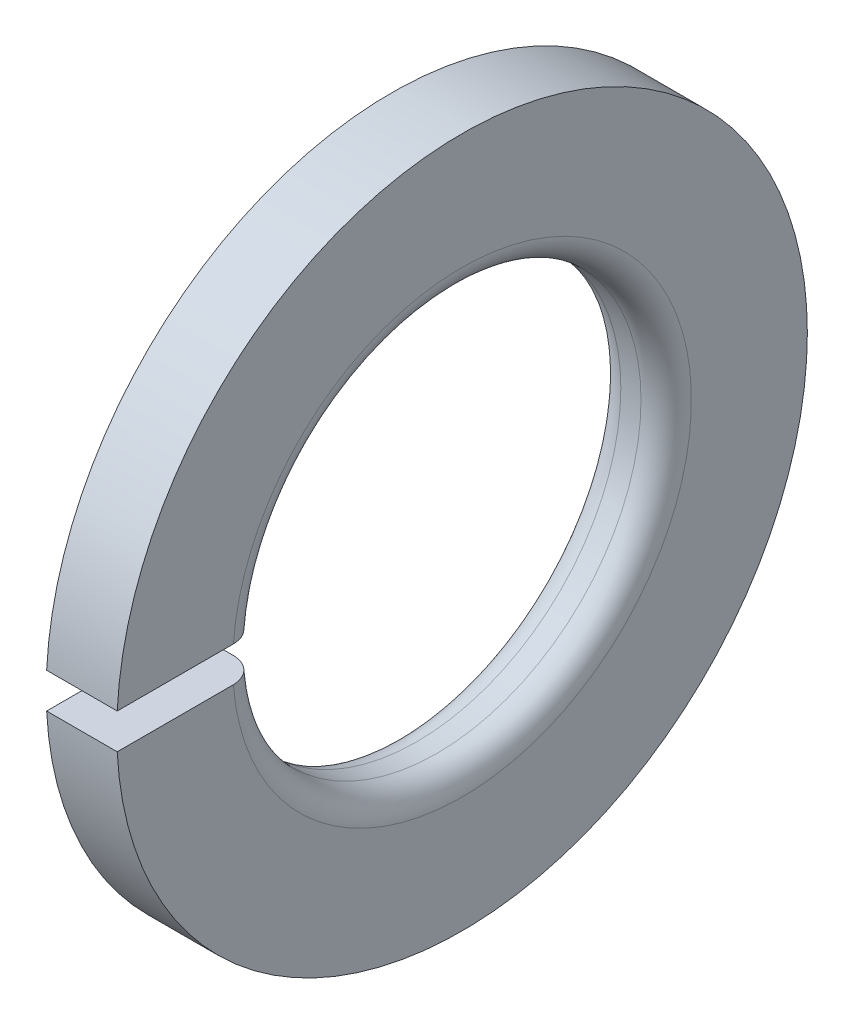
ISO-10303-21;
HEADER;
FILE_DESCRIPTION(('STEP AP214'),'2;1');
FILE_NAME('part.step','',(''),(''),'','','');
FILE_SCHEMA(('AUTOMOTIVE_DESIGN { 1 0 10303 214 1 1 1 1 }'));
ENDSEC;
DATA;
#1=APPLICATION_CONTEXT('core data for automotive mechanical design processes');
#2=APPLICATION_PROTOCOL_DEFINITION('international standard','automotive_design',2000,#1);
#3=PRODUCT_CONTEXT('',#1,'mechanical');
#4=PRODUCT('Part','Part','',(#3));
#5=PRODUCT_RELATED_PRODUCT_CATEGORY('part','',(#4));
#6=PRODUCT_DEFINITION_FORMATION('','',#4);
#7=PRODUCT_DEFINITION_CONTEXT('part definition',#1,'design');
#8=PRODUCT_DEFINITION('design','',#6,#7);
#9=PRODUCT_DEFINITION_SHAPE('','',#8);
#10=(LENGTH_UNIT() NAMED_UNIT(*) SI_UNIT(.MILLI.,.METRE.));
#11=(NAMED_UNIT(*) PLANE_ANGLE_UNIT() SI_UNIT($,.RADIAN.));
#12=(NAMED_UNIT(*) SI_UNIT($,.STERADIAN.) SOLID_ANGLE_UNIT());
#13=UNCERTAINTY_MEASURE_WITH_UNIT(LENGTH_MEASURE(1.E-05),#10,'distance_accuracy_value','');
#14=(GEOMETRIC_REPRESENTATION_CONTEXT(3) GLOBAL_UNCERTAINTY_ASSIGNED_CONTEXT((#13)) GLOBAL_UNIT_ASSIGNED_CONTEXT((#10,
#11,#12)) REPRESENTATION_CONTEXT('',''));
#15=CARTESIAN_POINT('',(0.,0.,0.));
#16=DIRECTION('',(0.,0.,1.));
#17=DIRECTION('',(1.,0.,0.));
#18=AXIS2_PLACEMENT_3D('',#15,#16,#17);
#19=CARTESIAN_POINT('',(-34.9249999999999,0.,0.));
#20=DIRECTION('',(-1.,0.,0.));
#21=DIRECTION('',(0.,0.,1.));
#22=AXIS2_PLACEMENT_3D('',#19,#20,#21);
#23=CYLINDRICAL_SURFACE('',#22,13.7);
#24=DIRECTION('',(-1.,0.,0.));
#25=VECTOR('',#24,1.);
#26=CARTESIAN_POINT('',(-34.9249999999999,0.7,13.6821051011897));
#27=LINE('',#26,#25);
#28=CARTESIAN_POINT('',(0.,0.7,13.6821051011897));
#29=VERTEX_POINT('',#28);
#30=CARTESIAN_POINT('',(-2.8,0.699999999999999,13.6821051011897));
#31=VERTEX_POINT('',#30);
#32=EDGE_CURVE('E55',#29,#31,#27,.T.);
#33=ORIENTED_EDGE('',*,*,#32,.F.);
#34=CARTESIAN_POINT('',(0.,0.,0.));
#35=DIRECTION('',(-1.,0.,0.));
#36=DIRECTION('',(0.,0.,1.));
#37=AXIS2_PLACEMENT_3D('',#34,#35,#36);
#38=CIRCLE('',#37,13.7);
#39=CARTESIAN_POINT('',(0.,-0.7,13.6821051011897));
#40=VERTEX_POINT('',#39);
#41=EDGE_CURVE('E113',#29,#40,#38,.T.);
#42=ORIENTED_EDGE('',*,*,#41,.T.);
#43=DIRECTION('',(-1.,0.,0.));
#44=VECTOR('',#43,1.);
#45=CARTESIAN_POINT('',(-34.9249999999999,-0.7,13.6821051011897));
#46=LINE('',#45,#44);
#47=CARTESIAN_POINT('',(-2.8,-0.7,13.6821051011897));
#48=VERTEX_POINT('',#47);
#49=EDGE_CURVE('E91',#48,#40,#46,.F.);
#50=ORIENTED_EDGE('',*,*,#49,.F.);
#51=CARTESIAN_POINT('',(-2.8,0.,0.));
#52=DIRECTION('',(-1.,0.,0.));
#53=DIRECTION('',(0.,0.,1.));
#54=AXIS2_PLACEMENT_3D('',#51,#52,#53);
#55=CIRCLE('',#54,13.7);
#56=EDGE_CURVE('E123',#31,#48,#55,.T.);
#57=ORIENTED_EDGE('',*,*,#56,.F.);
#58=EDGE_LOOP('',(#33,#42,#50,#57));
#59=FACE_BOUND('',#58,.T.);
#60=ADVANCED_FACE('F39',(#59),#23,.T.);
#61=CARTESIAN_POINT('',(0.,9.1,0.));
#62=DIRECTION('',(-1.,0.,0.));
#63=DIRECTION('',(0.,0.,1.));
#64=AXIS2_PLACEMENT_3D('',#61,#62,#63);
#65=PLANE('',#64);
#66=DIRECTION('',(0.,0.,-1.));
#67=VECTOR('',#66,1.);
#68=CARTESIAN_POINT('',(0.,0.7,13.974));
#69=LINE('',#68,#67);
#70=CARTESIAN_POINT('',(0.,0.7,9.073036977771));
#71=VERTEX_POINT('',#70);
#72=EDGE_CURVE('E100',#29,#71,#69,.T.);
#73=ORIENTED_EDGE('',*,*,#72,.T.);
#74=CARTESIAN_POINT('',(0.,0.,0.));
#75=DIRECTION('',(-1.,0.,0.));
#76=DIRECTION('',(0.,0.,1.));
#77=AXIS2_PLACEMENT_3D('',#74,#75,#76);
#78=CIRCLE('',#77,9.1);
#79=CARTESIAN_POINT('',(0.,-0.7,9.073036977771));
#80=VERTEX_POINT('',#79);
#81=EDGE_CURVE('E106',#71,#80,#78,.T.);
#82=ORIENTED_EDGE('',*,*,#81,.T.);
#83=DIRECTION('',(0.,0.,1.));
#84=VECTOR('',#83,1.);
#85=CARTESIAN_POINT('',(0.,-0.7,0.));
#86=LINE('',#85,#84);
#87=EDGE_CURVE('E89',#80,#40,#86,.T.);
#88=ORIENTED_EDGE('',*,*,#87,.T.);
#89=ORIENTED_EDGE('',*,*,#41,.F.);
#90=EDGE_LOOP('',(#73,#82,#88,#89));
#91=FACE_BOUND('',#90,.T.);
#92=ADVANCED_FACE('F115',(#91),#65,.F.);
#93=CARTESIAN_POINT('',(-1.,0.,0.));
#94=DIRECTION('',(-1.,0.,0.));
#95=DIRECTION('',(0.,0.,1.));
#96=AXIS2_PLACEMENT_3D('',#93,#94,#95);
#97=TOROIDAL_SURFACE('',#96,9.1,1.);
#98=ORIENTED_EDGE('',*,*,#81,.F.);
#99=CARTESIAN_POINT('',(-0.662612223968042,0.7,8.12854923771154));
#100=CARTESIAN_POINT('',(-0.715290187184425,0.7,8.10960209112794));
#101=CARTESIAN_POINT('',(-0.769604490981388,0.7,8.09508547757077));
#102=CARTESIAN_POINT('',(-0.879943985011158,0.7,8.07536673973953));
#103=CARTESIAN_POINT('',(-0.935971109099094,0.7,8.07017557147823));
#104=CARTESIAN_POINT('',(-1.04808100072817,0.7,8.06928105309722));
#105=CARTESIAN_POINT('',(-1.10416373188471,0.7,8.07357343455055));
#106=CARTESIAN_POINT('',(-1.21479686972179,0.7,8.09151311798309));
#107=CARTESIAN_POINT('',(-1.26934764208393,0.7,8.10515816736053));
#108=CARTESIAN_POINT('',(-1.37539140132287,0.7,8.1414051319421));
#109=CARTESIAN_POINT('',(-1.42688417551952,0.7,8.164007669292));
#110=CARTESIAN_POINT('',(-1.52535824885668,0.7,8.21751835592763));
#111=CARTESIAN_POINT('',(-1.57233933290822,0.7,8.24842690092499));
#112=CARTESIAN_POINT('',(-1.66057357248227,0.7,8.31774363364718));
#113=CARTESIAN_POINT('',(-1.70181327543891,0.7,8.35616894392833));
#114=CARTESIAN_POINT('',(-1.77728353312244,0.7,8.43937649820842));
#115=CARTESIAN_POINT('',(-1.81151397169577,0.7,8.48415884753178));
#116=CARTESIAN_POINT('',(-1.872118219197,0.7,8.57897480683965));
#117=CARTESIAN_POINT('',(-1.89846459379726,0.7,8.62902595272247));
#118=CARTESIAN_POINT('',(-1.94240697284814,0.7,8.73283232009971));
#119=CARTESIAN_POINT('',(-1.9600028492787,0.7,8.78658759577257));
#120=CARTESIAN_POINT('',(-1.98598908804086,0.7,8.89643434965801));
#121=CARTESIAN_POINT('',(-1.99435421122937,0.7,8.95253180000836));
#122=CARTESIAN_POINT('',(-2.001556851649,0.7,9.06533538025177));
#123=CARTESIAN_POINT('',(-2.00039428955911,0.7,9.12204151520838));
#124=CARTESIAN_POINT('',(-1.98856554771714,0.7,9.23450309817939));
#125=CARTESIAN_POINT('',(-1.97789128424346,0.7,9.29025769642485));
#126=CARTESIAN_POINT('',(-1.94732360140483,0.7,9.39917999489627));
#127=CARTESIAN_POINT('',(-1.92743021812544,0.7,9.45234770524695));
#128=CARTESIAN_POINT('',(-1.87900768811972,0.7,9.5545218540676));
#129=CARTESIAN_POINT('',(-1.85048808871843,0.7,9.6035328167463));
#130=CARTESIAN_POINT('',(-1.78560729700964,0.7,9.6960563071021));
#131=CARTESIAN_POINT('',(-1.74924619209137,0.7,9.73956889604696));
#132=CARTESIAN_POINT('',(-1.66980388227848,0.7,9.8197515832266));
#133=CARTESIAN_POINT('',(-1.62673846953807,0.7,9.85643732744043));
#134=CARTESIAN_POINT('',(-1.53504671660828,0.7,9.92203619941413));
#135=CARTESIAN_POINT('',(-1.4864204533591,0.7,9.95094943469627));
#136=CARTESIAN_POINT('',(-1.38511893512821,0.7,10.0001070958684));
#137=CARTESIAN_POINT('',(-1.33245416335104,0.7,10.0203731258802));
#138=CARTESIAN_POINT('',(-1.2244661377543,0.7,10.0517577626579));
#139=CARTESIAN_POINT('',(-1.16914291378149,0.7,10.0628764720965));
#140=CARTESIAN_POINT('',(-1.05751558605269,0.7,10.0756341759747));
#141=CARTESIAN_POINT('',(-1.00121343419212,0.7,10.0772902543729));
#142=CARTESIAN_POINT('',(-0.88913124376719,0.7,10.0711209067789));
#143=CARTESIAN_POINT('',(-0.833351202403051,0.7,10.0632955316596));
#144=CARTESIAN_POINT('',(-0.723927237746713,0.7,10.0383952938473));
#145=CARTESIAN_POINT('',(-0.670282183080897,0.7,10.0213254020063));
#146=CARTESIAN_POINT('',(-0.566615631176858,0.7,9.97842937843337));
#147=CARTESIAN_POINT('',(-0.516594143798551,0.7,9.95260322287635));
#148=CARTESIAN_POINT('',(-0.421544725833252,0.7,9.89290726969362));
#149=CARTESIAN_POINT('',(-0.376521257930688,0.7,9.8590303670492));
#150=CARTESIAN_POINT('',(-0.292786344089414,0.7,9.78421280440886));
#151=CARTESIAN_POINT('',(-0.254074950161213,0.7,9.74327208621394));
#152=CARTESIAN_POINT('',(-0.183976523702315,0.7,9.65540102628795));
#153=CARTESIAN_POINT('',(-0.152604635323968,0.7,9.60845860392524));
#154=CARTESIAN_POINT('',(-0.0981636876420108,0.7,9.50998372210034));
#155=CARTESIAN_POINT('',(-0.0750947568726635,0.7,9.45845119159622));
#156=CARTESIAN_POINT('',(-0.037852821167495,0.7,9.35211817316768));
#157=CARTESIAN_POINT('',(-0.0237026781344732,0.7,9.29730967794539));
#158=CARTESIAN_POINT('',(-0.00478318965724145,0.7,9.18609666721856));
#159=CARTESIAN_POINT('',(-1.39876148040783E-05,0.7,9.12969212732944));
#160=CARTESIAN_POINT('',(1.39556668232213E-05,0.7,9.01675985166794));
#161=CARTESIAN_POINT('',(-0.00474764154095429,0.7,8.96023211012359));
#162=CARTESIAN_POINT('',(-0.023686204729508,0.7,8.84877833925974));
#163=CARTESIAN_POINT('',(-0.0378628719536005,0.7,8.79385225917444));
#164=CARTESIAN_POINT('',(-0.0752439744802041,0.7,8.68712722469199));
#165=CARTESIAN_POINT('',(-0.0984536308746889,0.7,8.63533009887745));
#166=CARTESIAN_POINT('',(-0.153257937364711,0.7,8.53636087234999));
#167=CARTESIAN_POINT('',(-0.184854635124728,0.7,8.48918990495293));
#168=CARTESIAN_POINT('',(-0.255503579684132,0.7,8.40088177133867));
#169=CARTESIAN_POINT('',(-0.294549315658855,0.7,8.35973939095738));
#170=CARTESIAN_POINT('',(-0.378985054976843,0.7,8.28465942454279));
#171=CARTESIAN_POINT('',(-0.424367252423489,0.7,8.25071310131935));
#172=CARTESIAN_POINT('',(-0.502233128389707,0.7,8.20215332114461));
#173=CARTESIAN_POINT('',(-0.533197434447881,0.7,8.18505636464488));
#174=CARTESIAN_POINT('',(-0.596761241176335,0.7,8.15423425186091));
#175=CARTESIAN_POINT('',(-0.62936073991182,0.7,8.14050909158721));
#176=CARTESIAN_POINT('',(-0.662612223968042,0.7,8.12854923771154));
#177=B_SPLINE_CURVE_WITH_KNOTS('',3,(#99,#100,#101,#102,#103,#104,#105,#106,#107,#108,#109,#110,
#111,#112,#113,#114,#115,#116,#117,#118,#119,#120,#121,#122,#123,#124,#125,#126,#127,#128,#129,
#130,#131,#132,#133,#134,#135,#136,#137,#138,#139,#140,#141,#142,#143,#144,#145,#146,#147,#148,
#149,#150,#151,#152,#153,#154,#155,#156,#157,#158,#159,#160,#161,#162,#163,#164,#165,#166,#167,
#168,#169,#170,#171,#172,#173,#174,#175,#176),.UNSPECIFIED.,.T.,.F.,(4,2,2,2,2,2,2,2,2,2,2,2,2,
2,2,2,2,2,2,2,2,2,2,2,2,2,2,2,2,2,2,2,2,2,2,2,2,2,4),(0.,0.167816609631195,0.335830250223273,
0.503768285385618,0.671665886668624,0.839575151388178,1.0074924169947,1.17579673412858,
1.34410384008073,1.51298997348338,1.68187857762275,1.85122782911842,2.02057849050162,
2.19007321555854,2.35956727718342,2.5288744283451,2.69817969276982,2.86709202613514,
3.03600202270374,3.20448750890241,3.3729711039371,3.54115042012433,3.70932883394481,
3.87741690651676,4.04550543644794,4.21374286392457,4.38198167758142,4.55056462822652,
4.7191501885144,4.88816615232488,5.05718469977815,5.22656431240323,5.39593855057293,
5.5654108332488,5.73492453006013,5.9042907368316,6.07345011234855,6.17937975695168,
6.28530927621953),.UNSPECIFIED.);
#178=CARTESIAN_POINT('',(-1.,0.7,8.06969640073281));
#179=VERTEX_POINT('',#178);
#180=EDGE_CURVE('E135',#71,#179,#177,.T.);
#181=ORIENTED_EDGE('',*,*,#180,.T.);
#182=CARTESIAN_POINT('',(-1.,0.,0.));
#183=DIRECTION('',(-1.,0.,0.));
#184=DIRECTION('',(0.,0.,1.));
#185=AXIS2_PLACEMENT_3D('',#182,#183,#184);
#186=CIRCLE('',#185,8.1);
#187=CARTESIAN_POINT('',(-1.,-0.7,8.06969640073281));
#188=VERTEX_POINT('',#187);
#189=EDGE_CURVE('E108',#179,#188,#186,.T.);
#190=ORIENTED_EDGE('',*,*,#189,.T.);
#191=CARTESIAN_POINT('',(-0.662612223968042,-0.7,8.12854923771154));
#192=CARTESIAN_POINT('',(-0.609750513722815,-0.7,8.14756782555578));
#193=CARTESIAN_POINT('',(-0.558459815561151,-0.7,8.17107597751682));
#194=CARTESIAN_POINT('',(-0.460516167113072,-0.7,8.22639837361904));
#195=CARTESIAN_POINT('',(-0.413869027375439,-0.7,8.25822284806573));
#196=CARTESIAN_POINT('',(-0.326601077949856,-0.7,8.32922967960356));
#197=CARTESIAN_POINT('',(-0.285976530462814,-0.7,8.36840743852187));
#198=CARTESIAN_POINT('',(-0.211872927246946,-0.7,8.45300084003635));
#199=CARTESIAN_POINT('',(-0.178392124476065,-0.7,8.49841495302232));
#200=CARTESIAN_POINT('',(-0.119415932888029,-0.7,8.59432631426805));
#201=CARTESIAN_POINT('',(-0.0939416555163977,-0.7,8.64483654475393));
#202=CARTESIAN_POINT('',(-0.0518077525781307,-0.7,8.74941094265725));
#203=CARTESIAN_POINT('',(-0.0351486130218473,-0.7,8.80347530584215));
#204=CARTESIAN_POINT('',(-0.011079555331549,-0.7,8.91377475452238));
#205=CARTESIAN_POINT('',(-0.00369410128962968,-0.7,8.97001517978885));
#206=CARTESIAN_POINT('',(0.0015379708881979,-0.7,9.08293817581716));
#207=CARTESIAN_POINT('',(-0.000615458324676138,-0.7,9.13962074877233));
#208=CARTESIAN_POINT('',(-0.014409549968247,-0.7,9.25186291079127));
#209=CARTESIAN_POINT('',(-0.0260572743787798,-0.7,9.30742163238463));
#210=CARTESIAN_POINT('',(-0.0585259172237821,-0.7,9.41579093982961));
#211=CARTESIAN_POINT('',(-0.0793467811145403,-0.7,9.46860154201953));
#212=CARTESIAN_POINT('',(-0.129548766796646,-0.7,9.56990606448398));
#213=CARTESIAN_POINT('',(-0.158919686356541,-0.7,9.61840504002949));
#214=CARTESIAN_POINT('',(-0.225405123010573,-0.7,9.70976838384723));
#215=CARTESIAN_POINT('',(-0.262519559259526,-0.7,9.75263281093861));
#216=CARTESIAN_POINT('',(-0.343345685833173,-0.7,9.83140145881032));
#217=CARTESIAN_POINT('',(-0.387041622912917,-0.7,9.86732184400106));
#218=CARTESIAN_POINT('',(-0.479856491353349,-0.7,9.93129490216333));
#219=CARTESIAN_POINT('',(-0.528975345747452,-0.7,9.95934768677844));
#220=CARTESIAN_POINT('',(-0.631109691701726,-0.7,10.0067167803775));
#221=CARTESIAN_POINT('',(-0.684115150398044,-0.7,10.0260547225917));
#222=CARTESIAN_POINT('',(-0.792623479260499,-0.7,10.0555396445508));
#223=CARTESIAN_POINT('',(-0.848126322216252,-0.7,10.0656867244098));
#224=CARTESIAN_POINT('',(-0.959949724377955,-0.7,10.0764877689692));
#225=CARTESIAN_POINT('',(-1.0162686818624,-0.7,10.0771583224671));
#226=CARTESIAN_POINT('',(-1.12821880285452,-0.7,10.0690298399332));
#227=CARTESIAN_POINT('',(-1.18384996973689,-0.7,10.0602308503831));
#228=CARTESIAN_POINT('',(-1.29281928317582,-0.7,10.0334227699568));
#229=CARTESIAN_POINT('',(-1.34615848056653,-0.7,10.015417949732));
#230=CARTESIAN_POINT('',(-1.4490611448731,-0.7,9.970717253043));
#231=CARTESIAN_POINT('',(-1.49862460138918,-0.7,9.94402135264132));
#232=CARTESIAN_POINT('',(-1.59262209112955,-0.7,9.88267285109236));
#233=CARTESIAN_POINT('',(-1.63705117719158,-0.7,9.84801267055862));
#234=CARTESIAN_POINT('',(-1.71947489699173,-0.7,9.77173948290556));
#235=CARTESIAN_POINT('',(-1.75746946974652,-0.7,9.73012640989738));
#236=CARTESIAN_POINT('',(-1.82603230455171,-0.7,9.64103705312816));
#237=CARTESIAN_POINT('',(-1.85658487005004,-0.7,9.59354868982735));
#238=CARTESIAN_POINT('',(-1.90930732617524,-0.7,9.49412689358048));
#239=CARTESIAN_POINT('',(-1.93147709798526,-0.7,9.44219339764238));
#240=CARTESIAN_POINT('',(-1.96686389882705,-0.7,9.33521335578623));
#241=CARTESIAN_POINT('',(-1.98005788515501,-0.7,9.28015918759816));
#242=CARTESIAN_POINT('',(-1.99703688784108,-0.7,9.16861858532629));
#243=CARTESIAN_POINT('',(-2.00082178989882,-0.7,9.11213213385172));
#244=CARTESIAN_POINT('',(-1.99887833494282,-0.7,8.99920600285017));
#245=CARTESIAN_POINT('',(-1.99313030497655,-0.7,8.94276666112899));
#246=CARTESIAN_POINT('',(-1.97224664754005,-0.7,8.83165188334189));
#247=CARTESIAN_POINT('',(-1.95711093920493,-0.7,8.77697646247452));
#248=CARTESIAN_POINT('',(-1.91786481301774,-0.7,8.67091052513279));
#249=CARTESIAN_POINT('',(-1.89374914791422,-0.7,8.61952194987113));
#250=CARTESIAN_POINT('',(-1.83722070916606,-0.7,8.52153046682707));
#251=CARTESIAN_POINT('',(-1.80480795844868,-0.7,8.474927545821));
#252=CARTESIAN_POINT('',(-1.73264985897026,-0.7,8.3879067752915));
#253=CARTESIAN_POINT('',(-1.69291510557847,-0.7,8.347480140985));
#254=CARTESIAN_POINT('',(-1.60720532209016,-0.7,8.27389845054775));
#255=CARTESIAN_POINT('',(-1.56123063858281,-0.7,8.24074299081601));
#256=CARTESIAN_POINT('',(-1.46450243597119,-0.7,8.18275770728946));
#257=CARTESIAN_POINT('',(-1.4137647684259,-0.7,8.15790143945778));
#258=CARTESIAN_POINT('',(-1.30881264448514,-0.7,8.11708643620165));
#259=CARTESIAN_POINT('',(-1.25459739050618,-0.7,8.10112975008805));
#260=CARTESIAN_POINT('',(-1.14441413755236,-0.7,8.07862035120529));
#261=CARTESIAN_POINT('',(-1.08845152881723,-0.7,8.07204117213077));
#262=CARTESIAN_POINT('',(-0.976264613812742,-0.7,8.06840287766803));
#263=CARTESIAN_POINT('',(-0.920040712052807,-0.7,8.07133211124116));
#264=CARTESIAN_POINT('',(-0.830102674351942,-0.7,8.08367379762872));
#265=CARTESIAN_POINT('',(-0.79596574914943,-0.7,8.09019440282947));
#266=CARTESIAN_POINT('',(-0.728556579041752,-0.7,8.10675474051055));
#267=CARTESIAN_POINT('',(-0.695284332297669,-0.7,8.11679446550609));
#268=CARTESIAN_POINT('',(-0.662612223968042,-0.7,8.12854923771154));
#269=B_SPLINE_CURVE_WITH_KNOTS('',3,(#191,#192,#193,#194,#195,#196,#197,#198,#199,#200,#201,
#202,#203,#204,#205,#206,#207,#208,#209,#210,#211,#212,#213,#214,#215,#216,#217,#218,#219,#220,
#221,#222,#223,#224,#225,#226,#227,#228,#229,#230,#231,#232,#233,#234,#235,#236,#237,#238,#239,
#240,#241,#242,#243,#244,#245,#246,#247,#248,#249,#250,#251,#252,#253,#254,#255,#256,#257,#258,
#259,#260,#261,#262,#263,#264,#265,#266,#267,#268),.UNSPECIFIED.,.T.,.F.,(4,2,2,2,2,2,2,2,2,2,2,
2,2,2,2,2,2,2,2,2,2,2,2,2,2,2,2,2,2,2,2,2,2,2,2,2,2,2,4),(0.,0.168409375106442,
0.337026901931727,0.505539337642443,0.674010515355882,0.842922258386276,1.01184331316043,
1.1812090538402,1.35057563521277,1.52006830872491,1.68955997444307,1.85885021989244,
2.02813869797735,2.19702822986953,2.3659153650481,2.53438092343128,2.70284464673312,
2.8710134352341,3.03918139827549,3.20727141767228,3.37536190003465,3.54361301691549,
3.71186572831286,3.88047030079094,4.04907726296319,4.2181154570795,4.3871557046406,
4.55654523199916,4.72593621848912,4.89542634080728,5.06491599477964,5.23416228625367,
5.4033991809969,5.57209156565441,5.74082277916532,5.90907683015793,6.07712479058898,
6.18121338372044,6.28530175546773),.UNSPECIFIED.);
#270=EDGE_CURVE('E92',#188,#80,#269,.T.);
#271=ORIENTED_EDGE('',*,*,#270,.T.);
#272=EDGE_LOOP('',(#98,#181,#190,#271));
#273=FACE_BOUND('',#272,.T.);
#274=ADVANCED_FACE('F104',(#273),#97,.T.);
#275=CARTESIAN_POINT('',(-34.9249999999999,0.,0.));
#276=DIRECTION('',(-1.,0.,0.));
#277=DIRECTION('',(0.,0.,1.));
#278=AXIS2_PLACEMENT_3D('',#275,#276,#277);
#279=CYLINDRICAL_SURFACE('',#278,8.1);
#280=DIRECTION('',(-1.,0.,0.));
#281=VECTOR('',#280,1.);
#282=CARTESIAN_POINT('',(-34.9249999999999,0.7,8.06969640073281));
#283=LINE('',#282,#281);
#284=CARTESIAN_POINT('',(-1.8,0.7,8.0696964007328));
#285=VERTEX_POINT('',#284);
#286=EDGE_CURVE('E138',#285,#179,#283,.F.);
#287=ORIENTED_EDGE('',*,*,#286,.F.);
#288=CARTESIAN_POINT('',(-1.8,0.,0.));
#289=DIRECTION('',(-1.,0.,0.));
#290=DIRECTION('',(0.,0.,1.));
#291=AXIS2_PLACEMENT_3D('',#288,#289,#290);
#292=CIRCLE('',#291,8.1);
#293=CARTESIAN_POINT('',(-1.8,-0.7,8.06969640073276));
#294=VERTEX_POINT('',#293);
#295=EDGE_CURVE('E116',#285,#294,#292,.T.);
#296=ORIENTED_EDGE('',*,*,#295,.T.);
#297=DIRECTION('',(-1.,0.,0.));
#298=VECTOR('',#297,1.);
#299=CARTESIAN_POINT('',(-34.9249999999999,-0.7,8.06969640073281));
#300=LINE('',#299,#298);
#301=EDGE_CURVE('E107',#188,#294,#300,.T.);
#302=ORIENTED_EDGE('',*,*,#301,.F.);
#303=ORIENTED_EDGE('',*,*,#189,.F.);
#304=EDGE_LOOP('',(#287,#296,#302,#303));
#305=FACE_BOUND('',#304,.T.);
#306=ADVANCED_FACE('F136',(#305),#279,.F.);
#307=CARTESIAN_POINT('',(-1.8,0.,0.));
#308=DIRECTION('',(-1.,0.,0.));
#309=DIRECTION('',(0.,0.,1.));
#310=AXIS2_PLACEMENT_3D('',#307,#308,#309);
#311=TOROIDAL_SURFACE('',#310,9.1,1.);
#312=ORIENTED_EDGE('',*,*,#295,.F.);
#313=CARTESIAN_POINT('',(-2.47305823604299,0.7,8.3310541906555));
#314=CARTESIAN_POINT('',(-2.51469463776467,0.7,8.36908204909314));
#315=CARTESIAN_POINT('',(-2.5531430690931,0.7,8.41066261738013));
#316=CARTESIAN_POINT('',(-2.62253998449151,0.7,8.49972777650769));
#317=CARTESIAN_POINT('',(-2.65347905988667,0.7,8.54721966229761));
#318=CARTESIAN_POINT('',(-2.70693459267975,0.7,8.64669701305282));
#319=CARTESIAN_POINT('',(-2.72945602038517,0.7,8.69867980390912));
#320=CARTESIAN_POINT('',(-2.76546220887784,0.7,8.80566957450818));
#321=CARTESIAN_POINT('',(-2.77894924792186,0.7,8.86067578802722));
#322=CARTESIAN_POINT('',(-2.79653584242357,0.7,8.97227045534861));
#323=CARTESIAN_POINT('',(-2.80061856904312,0.7,9.02886156247699));
#324=CARTESIAN_POINT('',(-2.79922960011387,0.7,9.14192899269878));
#325=CARTESIAN_POINT('',(-2.79375747006411,0.7,9.19840531045529));
#326=CARTESIAN_POINT('',(-2.77340396019554,0.7,9.30965786099396));
#327=CARTESIAN_POINT('',(-2.75851917931221,0.7,9.36443347175277));
#328=CARTESIAN_POINT('',(-2.71975156467839,0.7,9.47070239341703));
#329=CARTESIAN_POINT('',(-2.69586880042329,0.7,9.52219572966933));
#330=CARTESIAN_POINT('',(-2.6398165820859,0.7,9.62035584550386));
#331=CARTESIAN_POINT('',(-2.60765926586733,0.7,9.66702955559755));
#332=CARTESIAN_POINT('',(-2.53594732483989,0.7,9.75429856423494));
#333=CARTESIAN_POINT('',(-2.49639280506047,0.7,9.79489394906721));
#334=CARTESIAN_POINT('',(-2.41111275689765,0.7,9.868747282405));
#335=CARTESIAN_POINT('',(-2.36540261045911,0.7,9.90202299260764));
#336=CARTESIAN_POINT('',(-2.26903350861435,0.7,9.96040606338601));
#337=CARTESIAN_POINT('',(-2.21837461519865,0.7,9.98551352626429));
#338=CARTESIAN_POINT('',(-2.1136783025299,0.7,10.0267852486078));
#339=CARTESIAN_POINT('',(-2.05964936542245,0.7,10.0429710265522));
#340=CARTESIAN_POINT('',(-1.94963915183289,0.7,10.0660263110747));
#341=CARTESIAN_POINT('',(-1.89365789598523,0.7,10.0728959160867));
#342=CARTESIAN_POINT('',(-1.78142516396302,0.7,10.0771175722908));
#343=CARTESIAN_POINT('',(-1.72517424314857,0.7,10.0744844024665));
#344=CARTESIAN_POINT('',(-1.61391364442461,0.7,10.0598092975508));
#345=CARTESIAN_POINT('',(-1.55890396222792,0.7,10.0477673949618));
#346=CARTESIAN_POINT('',(-1.45169820470142,0.7,10.0146246269796));
#347=CARTESIAN_POINT('',(-1.39950152810924,0.7,9.99352570618054));
#348=CARTESIAN_POINT('',(-1.29938546538947,0.7,9.94287425633482));
#349=CARTESIAN_POINT('',(-1.25146609623647,0.7,9.91332169374168));
#350=CARTESIAN_POINT('',(-1.16120159519412,0.7,9.84656784733547));
#351=CARTESIAN_POINT('',(-1.11886313486214,0.7,9.80935754288963));
#352=CARTESIAN_POINT('',(-1.04101718660826,0.7,9.7283712665231));
#353=CARTESIAN_POINT('',(-1.00550977131422,0.7,9.68459522480412));
#354=CARTESIAN_POINT('',(-0.942247850035591,0.7,9.5916167549614));
#355=CARTESIAN_POINT('',(-0.914510813247206,0.7,9.54240244128721));
#356=CARTESIAN_POINT('',(-0.867668705220239,0.7,9.44002450756643));
#357=CARTESIAN_POINT('',(-0.84856375418515,0.7,9.3868608325362));
#358=CARTESIAN_POINT('',(-0.819478161152514,0.7,9.27794832212162));
#359=CARTESIAN_POINT('',(-0.80952087206363,0.7,9.22219324988919));
#360=CARTESIAN_POINT('',(-0.799088796467972,0.7,9.10980279697528));
#361=CARTESIAN_POINT('',(-0.798614132691238,0.7,9.05316740490965));
#362=CARTESIAN_POINT('',(-0.807165655076044,0.7,8.94051122562121));
#363=CARTESIAN_POINT('',(-0.816209664724088,0.7,8.88449179056353));
#364=CARTESIAN_POINT('',(-0.843571313839399,0.7,8.77476507092983));
#365=CARTESIAN_POINT('',(-0.861888990239187,0.7,8.72105779556296));
#366=CARTESIAN_POINT('',(-0.907290176805633,0.7,8.61746898017333));
#367=CARTESIAN_POINT('',(-0.934375892309678,0.7,8.56758840655117));
#368=CARTESIAN_POINT('',(-0.996551439793716,0.7,8.47309305560692));
#369=CARTESIAN_POINT('',(-1.03164123139229,0.7,8.42847825172019));
#370=CARTESIAN_POINT('',(-1.10876578081621,0.7,8.34587170188868));
#371=CARTESIAN_POINT('',(-1.15078789135526,0.7,8.3078681491488));
#372=CARTESIAN_POINT('',(-1.24063405840602,0.7,8.23948308857648));
#373=CARTESIAN_POINT('',(-1.28845802450409,0.7,8.20910146198984));
#374=CARTESIAN_POINT('',(-1.38838404069375,0.7,8.15692929835717));
#375=CARTESIAN_POINT('',(-1.44047164846477,0.7,8.13511110007781));
#376=CARTESIAN_POINT('',(-1.54757576175858,0.7,8.10056151581356));
#377=CARTESIAN_POINT('',(-1.60259209358395,0.7,8.08782959158171));
#378=CARTESIAN_POINT('',(-1.71380190345154,0.7,8.07184920510227));
#379=CARTESIAN_POINT('',(-1.76999097428851,0.7,8.06857005381763));
#380=CARTESIAN_POINT('',(-1.88213571269629,0.7,8.07150471219479));
#381=CARTESIAN_POINT('',(-1.93809132109531,0.7,8.0777207973849));
#382=CARTESIAN_POINT('',(-2.04811575575788,0.7,8.09945626353526));
#383=CARTESIAN_POINT('',(-2.10218596073151,0.7,8.11496868884364));
#384=CARTESIAN_POINT('',(-2.20691140858704,0.7,8.15483299311751));
#385=CARTESIAN_POINT('',(-2.2575706788778,0.7,8.17917422263341));
#386=CARTESIAN_POINT('',(-2.33573263572781,0.7,8.22516536887863));
#387=CARTESIAN_POINT('',(-2.36472686012012,0.7,8.24433057034018));
#388=CARTESIAN_POINT('',(-2.42056977300416,0.7,8.28556616920884));
#389=CARTESIAN_POINT('',(-2.44741846271373,0.7,8.30763656496691));
#390=CARTESIAN_POINT('',(-2.47305823604299,0.7,8.3310541906555));
#391=B_SPLINE_CURVE_WITH_KNOTS('',3,(#313,#314,#315,#316,#317,#318,#319,#320,#321,#322,#323,
#324,#325,#326,#327,#328,#329,#330,#331,#332,#333,#334,#335,#336,#337,#338,#339,#340,#341,#342,
#343,#344,#345,#346,#347,#348,#349,#350,#351,#352,#353,#354,#355,#356,#357,#358,#359,#360,#361,
#362,#363,#364,#365,#366,#367,#368,#369,#370,#371,#372,#373,#374,#375,#376,#377,#378,#379,#380,
#381,#382,#383,#384,#385,#386,#387,#388,#389,#390),.UNSPECIFIED.,.T.,.F.,(4,2,2,2,2,2,2,2,2,2,2,
2,2,2,2,2,2,2,2,2,2,2,2,2,2,2,2,2,2,2,2,2,2,2,2,2,2,2,4),(0.,0.169039480508828,
0.338289674312807,0.507439773708233,0.676547201419154,0.845957009343746,1.01537452127114,
1.18485328367862,1.35433073715369,1.52356098904981,1.6927888383067,1.86160140008657,
2.03041184750601,2.19881333416107,2.36721304148469,2.53535096177295,2.70348830123341,
2.87158955867935,3.03969148320877,3.20799257295336,3.3762954519808,3.54497372372923,
3.71365434428338,3.88276439967433,4.05187664379145,4.22130611082768,4.39073625262471,
4.560209042649,4.72968097768393,4.89884708061,5.06801054766223,5.23662300204924,
5.40522546744868,5.57327993418439,5.74137468140121,5.90934381452669,6.07711101064679,
6.18120589504696,6.28530072036142),.UNSPECIFIED.);
#392=CARTESIAN_POINT('',(-2.8,0.7,9.07303697777101));
#393=VERTEX_POINT('',#392);
#394=EDGE_CURVE('E126',#285,#393,#391,.T.);
#395=ORIENTED_EDGE('',*,*,#394,.T.);
#396=CARTESIAN_POINT('',(-2.8,0.,0.));
#397=DIRECTION('',(-1.,0.,0.));
#398=DIRECTION('',(0.,0.,1.));
#399=AXIS2_PLACEMENT_3D('',#396,#397,#398);
#400=CIRCLE('',#399,9.1);
#401=CARTESIAN_POINT('',(-2.8,-0.699999999999999,9.073036977771));
#402=VERTEX_POINT('',#401);
#403=EDGE_CURVE('E128',#393,#402,#400,.T.);
#404=ORIENTED_EDGE('',*,*,#403,.T.);
#405=CARTESIAN_POINT('',(-2.47305823604299,-0.7,8.3310541906555));
#406=CARTESIAN_POINT('',(-2.43162167081711,-0.7,8.29321557159718));
#407=CARTESIAN_POINT('',(-2.38696836299209,-0.7,8.25884022111814));
#408=CARTESIAN_POINT('',(-2.29249056341311,-0.7,8.19804051315558));
#409=CARTESIAN_POINT('',(-2.2426601232244,-0.7,8.17162544084288));
#410=CARTESIAN_POINT('',(-2.13928044243262,-0.7,8.12755271541435));
#411=CARTESIAN_POINT('',(-2.08573249015545,-0.7,8.10989204550976));
#412=CARTESIAN_POINT('',(-1.97644243716689,-0.7,8.08383740053045));
#413=CARTESIAN_POINT('',(-1.92070088400255,-0.7,8.07544112796454));
#414=CARTESIAN_POINT('',(-1.80870660902974,-0.7,8.06815837033052));
#415=CARTESIAN_POINT('',(-1.75245506344991,-0.7,8.06925379742786));
#416=CARTESIAN_POINT('',(-1.64093396835537,-0.7,8.08087980982284));
#417=CARTESIAN_POINT('',(-1.58566444974646,-0.7,8.09141069153317));
#418=CARTESIAN_POINT('',(-1.47771291597907,-0.7,8.12159173981765));
#419=CARTESIAN_POINT('',(-1.42502927023722,-0.7,8.14123607582538));
#420=CARTESIAN_POINT('',(-1.32369859028284,-0.7,8.18907381013206));
#421=CARTESIAN_POINT('',(-1.27505158062471,-0.7,8.21726726042946));
#422=CARTESIAN_POINT('',(-1.18306865580983,-0.7,8.2814570027476));
#423=CARTESIAN_POINT('',(-1.13974339615419,-0.7,8.31746856233312));
#424=CARTESIAN_POINT('',(-1.0597281498026,-0.7,8.3962318912944));
#425=CARTESIAN_POINT('',(-1.02303826914165,-0.7,8.43898376836166));
#426=CARTESIAN_POINT('',(-0.957203245574867,-0.7,8.53016903599848));
#427=CARTESIAN_POINT('',(-0.928084044786175,-0.7,8.57862115671498));
#428=CARTESIAN_POINT('',(-0.878365290350662,-0.7,8.67971547962862));
#429=CARTESIAN_POINT('',(-0.857765893388612,-0.7,8.73235775886431));
#430=CARTESIAN_POINT('',(-0.825612820084441,-0.7,8.84050585104161));
#431=CARTESIAN_POINT('',(-0.814086064587622,-0.7,8.89601966907701));
#432=CARTESIAN_POINT('',(-0.800503516682336,-0.7,9.00819430951323));
#433=CARTESIAN_POINT('',(-0.798447806792097,-0.7,9.06485514190332));
#434=CARTESIAN_POINT('',(-0.803871189004435,-0.7,9.17778744191355));
#435=CARTESIAN_POINT('',(-0.81136174008628,-0.7,9.23405835991913));
#436=CARTESIAN_POINT('',(-0.835691183329549,-0.7,9.34454197574356));
#437=CARTESIAN_POINT('',(-0.852530059732581,-0.7,9.39875467703177));
#438=CARTESIAN_POINT('',(-0.895069029765445,-0.7,9.50353356306684));
#439=CARTESIAN_POINT('',(-0.920761937372392,-0.7,9.55410266487775));
#440=CARTESIAN_POINT('',(-0.980290746766137,-0.7,9.65019677685416));
#441=CARTESIAN_POINT('',(-1.01412656426048,-0.7,9.6957218392266));
#442=CARTESIAN_POINT('',(-1.08890309061444,-0.7,9.7803278398373));
#443=CARTESIAN_POINT('',(-1.12982810691978,-0.7,9.81942264701828));
#444=CARTESIAN_POINT('',(-1.21767534498013,-0.7,9.89016530115952));
#445=CARTESIAN_POINT('',(-1.26459748455189,-0.7,9.92181325015301));
#446=CARTESIAN_POINT('',(-1.36297821761239,-0.7,9.97667919428882));
#447=CARTESIAN_POINT('',(-1.41442493380669,-0.7,9.99991848733887));
#448=CARTESIAN_POINT('',(-1.52049477876916,-0.7,10.0374105457277));
#449=CARTESIAN_POINT('',(-1.57511786902996,-0.7,10.0516634199846));
#450=CARTESIAN_POINT('',(-1.6858739832089,-0.7,10.0707524445036));
#451=CARTESIAN_POINT('',(-1.74200381161807,-0.7,10.0756071389678));
#452=CARTESIAN_POINT('',(-1.85428098815221,-0.7,10.0758161505303));
#453=CARTESIAN_POINT('',(-1.91042833616982,-0.7,10.071170524745));
#454=CARTESIAN_POINT('',(-2.02110144523104,-0.7,10.0525200398541));
#455=CARTESIAN_POINT('',(-2.07562842551515,-0.7,10.0385224139609));
#456=CARTESIAN_POINT('',(-2.18156063493294,-0.7,10.0015773286251));
#457=CARTESIAN_POINT('',(-2.23296586412198,-0.7,9.9786298693412));
#458=CARTESIAN_POINT('',(-2.33123379933745,-0.7,9.92442479269278));
#459=CARTESIAN_POINT('',(-2.37809351825632,-0.7,9.8931617605195));
#460=CARTESIAN_POINT('',(-2.46591188092559,-0.7,9.82322608331564));
#461=CARTESIAN_POINT('',(-2.50687046547592,-0.7,9.78455336396029));
#462=CARTESIAN_POINT('',(-2.5818084263118,-0.7,9.70082016515584));
#463=CARTESIAN_POINT('',(-2.61577450651972,-0.7,9.65574778679878));
#464=CARTESIAN_POINT('',(-2.67568004206479,-0.7,9.56055210234871));
#465=CARTESIAN_POINT('',(-2.70161937536355,-0.7,9.51042871947575));
#466=CARTESIAN_POINT('',(-2.74480504042883,-0.7,9.40641744193269));
#467=CARTESIAN_POINT('',(-2.76202905444492,-0.7,9.35252028087117));
#468=CARTESIAN_POINT('',(-2.78720613738252,-0.7,9.24260455623013));
#469=CARTESIAN_POINT('',(-2.79515943980961,-0.7,9.18658604611868));
#470=CARTESIAN_POINT('',(-2.80158539405554,-0.7,9.073886508594));
#471=CARTESIAN_POINT('',(-2.80003753145339,-0.7,9.01720431154275));
#472=CARTESIAN_POINT('',(-2.78745641483657,-0.7,8.90488670877913));
#473=CARTESIAN_POINT('',(-2.77642073402733,-0.7,8.84925157460534));
#474=CARTESIAN_POINT('',(-2.7451527718163,-0.7,8.74054560521298));
#475=CARTESIAN_POINT('',(-2.72490708078742,-0.7,8.68747863428188));
#476=CARTESIAN_POINT('',(-2.67579497980849,-0.7,8.58554965424336));
#477=CARTESIAN_POINT('',(-2.64693893853178,-0.7,8.53668267811137));
#478=CARTESIAN_POINT('',(-2.59359611846522,-0.7,8.46161298112353));
#479=CARTESIAN_POINT('',(-2.57144811516547,-0.7,8.43371835898182));
#480=CARTESIAN_POINT('',(-2.52431733181371,-0.7,8.38043633152268));
#481=CARTESIAN_POINT('',(-2.49933455074069,-0.7,8.35504892710827));
#482=CARTESIAN_POINT('',(-2.47305823604299,-0.7,8.3310541906555));
#483=B_SPLINE_CURVE_WITH_KNOTS('',3,(#405,#406,#407,#408,#409,#410,#411,#412,#413,#414,#415,
#416,#417,#418,#419,#420,#421,#422,#423,#424,#425,#426,#427,#428,#429,#430,#431,#432,#433,#434,
#435,#436,#437,#438,#439,#440,#441,#442,#443,#444,#445,#446,#447,#448,#449,#450,#451,#452,#453,
#454,#455,#456,#457,#458,#459,#460,#461,#462,#463,#464,#465,#466,#467,#468,#469,#470,#471,#472,
#473,#474,#475,#476,#477,#478,#479,#480,#481,#482),.UNSPECIFIED.,.T.,.F.,(4,2,2,2,2,2,2,2,2,2,2,
2,2,2,2,2,2,2,2,2,2,2,2,2,2,2,2,2,2,2,2,2,2,2,2,2,2,2,4),(0.,0.168211839020245,
0.336619133952563,0.504968354899875,0.673275817292587,0.841262615618274,1.00925469139653,
1.1771394378342,1.34502520542102,1.51324182545342,1.68146113339154,1.85024949195619,
2.01904095451124,2.1883313959103,2.3576233122807,2.52711863194892,2.69661366590119,
2.86597145866629,3.03532749837614,3.20431333572889,3.37329685758509,3.5418493219396,
3.71039974334855,3.87861724585512,4.04683373703432,4.21492027321001,4.38300680640484,
4.55120306073459,4.71940100228848,4.88791587282229,5.05643330532472,5.22538011215809,
5.39432266356068,5.56363011504993,5.73298088489506,5.90257901984434,6.0719737415606,
6.17864246764683,6.28531123215184),.UNSPECIFIED.);
#484=EDGE_CURVE('E58',#402,#294,#483,.T.);
#485=ORIENTED_EDGE('',*,*,#484,.T.);
#486=EDGE_LOOP('',(#312,#395,#404,#485));
#487=FACE_BOUND('',#486,.T.);
#488=ADVANCED_FACE('F141',(#487),#311,.T.);
#489=CARTESIAN_POINT('',(-2.8,13.7,0.));
#490=DIRECTION('',(1.,0.,0.));
#491=DIRECTION('',(0.,0.,-1.));
#492=AXIS2_PLACEMENT_3D('',#489,#490,#491);
#493=PLANE('',#492);
#494=DIRECTION('',(0.,0.,-1.));
#495=VECTOR('',#494,1.);
#496=CARTESIAN_POINT('',(-2.8,0.699999999999999,0.));
#497=LINE('',#496,#495);
#498=EDGE_CURVE('E11',#31,#393,#497,.T.);
#499=ORIENTED_EDGE('',*,*,#498,.F.);
#500=ORIENTED_EDGE('',*,*,#56,.T.);
#501=DIRECTION('',(0.,0.,1.));
#502=VECTOR('',#501,1.);
#503=CARTESIAN_POINT('',(-2.8,-0.699999999999999,0.));
#504=LINE('',#503,#502);
#505=EDGE_CURVE('E46',#402,#48,#504,.T.);
#506=ORIENTED_EDGE('',*,*,#505,.F.);
#507=ORIENTED_EDGE('',*,*,#403,.F.);
#508=EDGE_LOOP('',(#499,#500,#506,#507));
#509=FACE_BOUND('',#508,.T.);
#510=ADVANCED_FACE('F127',(#509),#493,.F.);
#511=CARTESIAN_POINT('',(-2.8,-0.7,0.));
#512=DIRECTION('',(0.,1.,0.));
#513=DIRECTION('',(0.,0.,1.));
#514=AXIS2_PLACEMENT_3D('',#511,#512,#513);
#515=PLANE('',#514);
#516=ORIENTED_EDGE('',*,*,#49,.T.);
#517=ORIENTED_EDGE('',*,*,#87,.F.);
#518=ORIENTED_EDGE('',*,*,#270,.F.);
#519=ORIENTED_EDGE('',*,*,#301,.T.);
#520=ORIENTED_EDGE('',*,*,#484,.F.);
#521=ORIENTED_EDGE('',*,*,#505,.T.);
#522=EDGE_LOOP('',(#516,#517,#518,#519,#520,#521));
#523=FACE_BOUND('',#522,.T.);
#524=ADVANCED_FACE('F88',(#523),#515,.T.);
#525=CARTESIAN_POINT('',(-2.8,0.7,13.974));
#526=DIRECTION('',(0.,-1.,0.));
#527=DIRECTION('',(0.,0.,-1.));
#528=AXIS2_PLACEMENT_3D('',#525,#526,#527);
#529=PLANE('',#528);
#530=ORIENTED_EDGE('',*,*,#32,.T.);
#531=ORIENTED_EDGE('',*,*,#498,.T.);
#532=ORIENTED_EDGE('',*,*,#394,.F.);
#533=ORIENTED_EDGE('',*,*,#286,.T.);
#534=ORIENTED_EDGE('',*,*,#180,.F.);
#535=ORIENTED_EDGE('',*,*,#72,.F.);
#536=EDGE_LOOP('',(#530,#531,#532,#533,#534,#535));
#537=FACE_BOUND('',#536,.T.);
#538=ADVANCED_FACE('F159',(#537),#529,.T.);
#539=CLOSED_SHELL('',(#60,#92,#274,#306,#488,#510,#524,#538));
#540=MANIFOLD_SOLID_BREP('B2',#539);
#541=ADVANCED_BREP_SHAPE_REPRESENTATION('',(#18,#540),#14);
#542=SHAPE_DEFINITION_REPRESENTATION(#9,#541);
ENDSEC;
END-ISO-10303-21;
